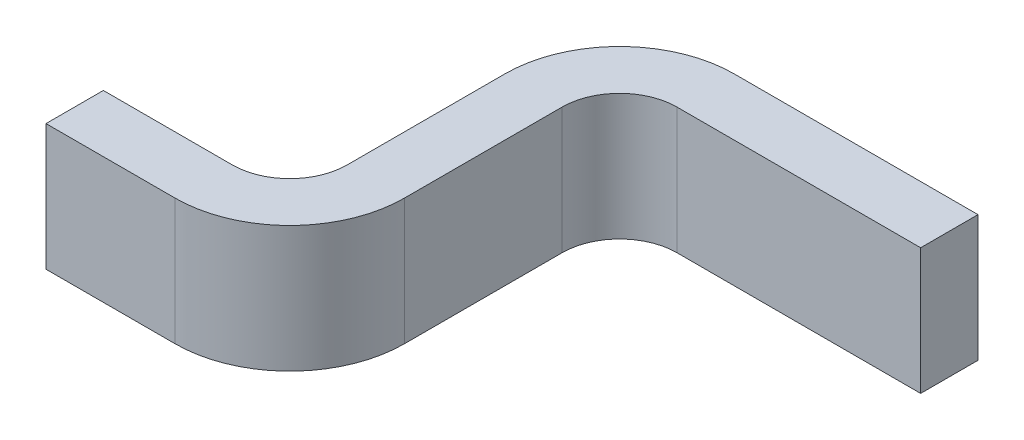
ISO-10303-21;
HEADER;
FILE_DESCRIPTION(('STEP AP214'),'2;1');
FILE_NAME('part.step','',(''),(''),'','','');
FILE_SCHEMA(('AUTOMOTIVE_DESIGN { 1 0 10303 214 1 1 1 1 }'));
ENDSEC;
DATA;
#1=APPLICATION_CONTEXT('core data for automotive mechanical design processes');
#2=APPLICATION_PROTOCOL_DEFINITION('international standard','automotive_design',2000,#1);
#3=PRODUCT_CONTEXT('',#1,'mechanical');
#4=PRODUCT('Part','Part','',(#3));
#5=PRODUCT_RELATED_PRODUCT_CATEGORY('part','',(#4));
#6=PRODUCT_DEFINITION_FORMATION('','',#4);
#7=PRODUCT_DEFINITION_CONTEXT('part definition',#1,'design');
#8=PRODUCT_DEFINITION('design','',#6,#7);
#9=PRODUCT_DEFINITION_SHAPE('','',#8);
#10=(LENGTH_UNIT() NAMED_UNIT(*) SI_UNIT(.MILLI.,.METRE.));
#11=(NAMED_UNIT(*) PLANE_ANGLE_UNIT() SI_UNIT($,.RADIAN.));
#12=(NAMED_UNIT(*) SI_UNIT($,.STERADIAN.) SOLID_ANGLE_UNIT());
#13=UNCERTAINTY_MEASURE_WITH_UNIT(LENGTH_MEASURE(1.E-05),#10,'distance_accuracy_value','');
#14=(GEOMETRIC_REPRESENTATION_CONTEXT(3) GLOBAL_UNCERTAINTY_ASSIGNED_CONTEXT((#13)) GLOBAL_UNIT_ASSIGNED_CONTEXT((#10,
#11,#12)) REPRESENTATION_CONTEXT('',''));
#15=CARTESIAN_POINT('',(0.,0.,0.));
#16=DIRECTION('',(0.,0.,1.));
#17=DIRECTION('',(1.,0.,0.));
#18=AXIS2_PLACEMENT_3D('',#15,#16,#17);
#19=CARTESIAN_POINT('',(0.,0.11,0.675));
#20=DIRECTION('',(0.,0.,-1.));
#21=DIRECTION('',(-1.,0.,0.));
#22=AXIS2_PLACEMENT_3D('',#19,#20,#21);
#23=PLANE('',#22);
#24=DIRECTION('',(1.,0.,0.));
#25=VECTOR('',#24,1.);
#26=CARTESIAN_POINT('',(0.,0.11,0.675));
#27=LINE('',#26,#25);
#28=CARTESIAN_POINT('',(0.225,0.11,0.675));
#29=VERTEX_POINT('',#28);
#30=CARTESIAN_POINT('',(0.,0.11,0.675));
#31=VERTEX_POINT('',#30);
#32=EDGE_CURVE('E104',#29,#31,#27,.F.);
#33=ORIENTED_EDGE('',*,*,#32,.T.);
#34=DIRECTION('',(0.,1.,0.));
#35=VECTOR('',#34,1.);
#36=CARTESIAN_POINT('',(0.,-0.11,0.675));
#37=LINE('',#36,#35);
#38=CARTESIAN_POINT('',(0.,-0.11,0.675));
#39=VERTEX_POINT('',#38);
#40=EDGE_CURVE('E113',#39,#31,#37,.T.);
#41=ORIENTED_EDGE('',*,*,#40,.F.);
#42=DIRECTION('',(1.,0.,0.));
#43=VECTOR('',#42,1.);
#44=CARTESIAN_POINT('',(0.,-0.11,0.675));
#45=LINE('',#44,#43);
#46=CARTESIAN_POINT('',(0.225,-0.11,0.675));
#47=VERTEX_POINT('',#46);
#48=EDGE_CURVE('E118',#39,#47,#45,.T.);
#49=ORIENTED_EDGE('',*,*,#48,.T.);
#50=DIRECTION('',(0.,1.,0.));
#51=VECTOR('',#50,1.);
#52=CARTESIAN_POINT('',(0.225,0.11,0.675));
#53=LINE('',#52,#51);
#54=EDGE_CURVE('E116',#29,#47,#53,.F.);
#55=ORIENTED_EDGE('',*,*,#54,.F.);
#56=EDGE_LOOP('',(#33,#41,#49,#55));
#57=FACE_BOUND('',#56,.T.);
#58=ADVANCED_FACE('F17',(#57),#23,.F.);
#59=CARTESIAN_POINT('',(0.,-0.11,0.575));
#60=DIRECTION('',(-1.,0.,0.));
#61=DIRECTION('',(0.,0.,1.));
#62=AXIS2_PLACEMENT_3D('',#59,#60,#61);
#63=PLANE('',#62);
#64=DIRECTION('',(0.,0.,1.));
#65=VECTOR('',#64,1.);
#66=CARTESIAN_POINT('',(0.,0.11,0.575));
#67=LINE('',#66,#65);
#68=CARTESIAN_POINT('',(0.,0.11,0.575));
#69=VERTEX_POINT('',#68);
#70=EDGE_CURVE('E111',#31,#69,#67,.F.);
#71=ORIENTED_EDGE('',*,*,#70,.T.);
#72=DIRECTION('',(0.,1.,0.));
#73=VECTOR('',#72,1.);
#74=CARTESIAN_POINT('',(0.,-0.11,0.575));
#75=LINE('',#74,#73);
#76=CARTESIAN_POINT('',(0.,-0.11,0.575));
#77=VERTEX_POINT('',#76);
#78=EDGE_CURVE('E127',#69,#77,#75,.F.);
#79=ORIENTED_EDGE('',*,*,#78,.T.);
#80=DIRECTION('',(0.,0.,1.));
#81=VECTOR('',#80,1.);
#82=CARTESIAN_POINT('',(0.,-0.11,0.675));
#83=LINE('',#82,#81);
#84=EDGE_CURVE('E140',#77,#39,#83,.T.);
#85=ORIENTED_EDGE('',*,*,#84,.T.);
#86=ORIENTED_EDGE('',*,*,#40,.T.);
#87=EDGE_LOOP('',(#71,#79,#85,#86));
#88=FACE_BOUND('',#87,.T.);
#89=ADVANCED_FACE('F277',(#88),#63,.T.);
#90=CARTESIAN_POINT('',(0.225,0.11,0.475));
#91=DIRECTION('',(0.,1.,0.));
#92=DIRECTION('',(0.,0.,1.));
#93=AXIS2_PLACEMENT_3D('',#90,#91,#92);
#94=CYLINDRICAL_SURFACE('',#93,0.2);
#95=CARTESIAN_POINT('',(0.225,0.11,0.475));
#96=DIRECTION('',(0.,1.,0.));
#97=DIRECTION('',(0.,0.,1.));
#98=AXIS2_PLACEMENT_3D('',#95,#96,#97);
#99=CIRCLE('',#98,0.2);
#100=CARTESIAN_POINT('',(0.425,0.11,0.475));
#101=VERTEX_POINT('',#100);
#102=EDGE_CURVE('E20',#29,#101,#99,.T.);
#103=ORIENTED_EDGE('',*,*,#102,.F.);
#104=ORIENTED_EDGE('',*,*,#54,.T.);
#105=CARTESIAN_POINT('',(0.225,-0.11,0.475));
#106=DIRECTION('',(0.,1.,0.));
#107=DIRECTION('',(0.,0.,1.));
#108=AXIS2_PLACEMENT_3D('',#105,#106,#107);
#109=CIRCLE('',#108,0.2);
#110=CARTESIAN_POINT('',(0.425,-0.11,0.475));
#111=VERTEX_POINT('',#110);
#112=EDGE_CURVE('E178',#111,#47,#109,.F.);
#113=ORIENTED_EDGE('',*,*,#112,.F.);
#114=DIRECTION('',(0.,1.,0.));
#115=VECTOR('',#114,1.);
#116=CARTESIAN_POINT('',(0.425,0.11,0.475));
#117=LINE('',#116,#115);
#118=EDGE_CURVE('E124',#111,#101,#117,.T.);
#119=ORIENTED_EDGE('',*,*,#118,.T.);
#120=EDGE_LOOP('',(#103,#104,#113,#119));
#121=FACE_BOUND('',#120,.T.);
#122=ADVANCED_FACE('F123',(#121),#94,.T.);
#123=CARTESIAN_POINT('',(0.,-0.11,0.575));
#124=DIRECTION('',(0.,0.,1.));
#125=DIRECTION('',(1.,0.,0.));
#126=AXIS2_PLACEMENT_3D('',#123,#124,#125);
#127=PLANE('',#126);
#128=DIRECTION('',(1.,0.,0.));
#129=VECTOR('',#128,1.);
#130=CARTESIAN_POINT('',(0.,-0.11,0.575));
#131=LINE('',#130,#129);
#132=CARTESIAN_POINT('',(0.225,-0.11,0.575));
#133=VERTEX_POINT('',#132);
#134=EDGE_CURVE('E131',#77,#133,#131,.T.);
#135=ORIENTED_EDGE('',*,*,#134,.F.);
#136=ORIENTED_EDGE('',*,*,#78,.F.);
#137=DIRECTION('',(1.,0.,0.));
#138=VECTOR('',#137,1.);
#139=CARTESIAN_POINT('',(0.,0.11,0.575));
#140=LINE('',#139,#138);
#141=CARTESIAN_POINT('',(0.225,0.11,0.575));
#142=VERTEX_POINT('',#141);
#143=EDGE_CURVE('E126',#142,#69,#140,.F.);
#144=ORIENTED_EDGE('',*,*,#143,.F.);
#145=DIRECTION('',(0.,1.,0.));
#146=VECTOR('',#145,1.);
#147=CARTESIAN_POINT('',(0.225,-0.11,0.575));
#148=LINE('',#147,#146);
#149=EDGE_CURVE('E175',#142,#133,#148,.F.);
#150=ORIENTED_EDGE('',*,*,#149,.T.);
#151=EDGE_LOOP('',(#135,#136,#144,#150));
#152=FACE_BOUND('',#151,.T.);
#153=ADVANCED_FACE('F271',(#152),#127,.F.);
#154=CARTESIAN_POINT('',(0.425,0.11,0.475));
#155=DIRECTION('',(-1.,0.,0.));
#156=DIRECTION('',(0.,0.,1.));
#157=AXIS2_PLACEMENT_3D('',#154,#155,#156);
#158=PLANE('',#157);
#159=DIRECTION('',(0.,0.,-1.));
#160=VECTOR('',#159,1.);
#161=CARTESIAN_POINT('',(0.425,0.11,0.475));
#162=LINE('',#161,#160);
#163=CARTESIAN_POINT('',(0.425,0.11,0.2));
#164=VERTEX_POINT('',#163);
#165=EDGE_CURVE('E177',#164,#101,#162,.F.);
#166=ORIENTED_EDGE('',*,*,#165,.T.);
#167=ORIENTED_EDGE('',*,*,#118,.F.);
#168=DIRECTION('',(0.,0.,1.));
#169=VECTOR('',#168,1.);
#170=CARTESIAN_POINT('',(0.425,-0.11,0.475));
#171=LINE('',#170,#169);
#172=CARTESIAN_POINT('',(0.425,-0.11,0.2));
#173=VERTEX_POINT('',#172);
#174=EDGE_CURVE('E174',#111,#173,#171,.F.);
#175=ORIENTED_EDGE('',*,*,#174,.T.);
#176=DIRECTION('',(0.,-1.,0.));
#177=VECTOR('',#176,1.);
#178=CARTESIAN_POINT('',(0.425,0.11,0.2));
#179=LINE('',#178,#177);
#180=EDGE_CURVE('E171',#173,#164,#179,.F.);
#181=ORIENTED_EDGE('',*,*,#180,.T.);
#182=EDGE_LOOP('',(#166,#167,#175,#181));
#183=FACE_BOUND('',#182,.T.);
#184=ADVANCED_FACE('F267',(#183),#158,.F.);
#185=CARTESIAN_POINT('',(0.225,-0.11,0.475));
#186=DIRECTION('',(0.,1.,0.));
#187=DIRECTION('',(0.,0.,1.));
#188=AXIS2_PLACEMENT_3D('',#185,#186,#187);
#189=CYLINDRICAL_SURFACE('',#188,0.1);
#190=CARTESIAN_POINT('',(0.225,-0.11,0.475));
#191=DIRECTION('',(0.,1.,0.));
#192=DIRECTION('',(0.,0.,1.));
#193=AXIS2_PLACEMENT_3D('',#190,#191,#192);
#194=CIRCLE('',#193,0.1);
#195=CARTESIAN_POINT('',(0.325,-0.11,0.475));
#196=VERTEX_POINT('',#195);
#197=EDGE_CURVE('E172',#133,#196,#194,.T.);
#198=ORIENTED_EDGE('',*,*,#197,.F.);
#199=ORIENTED_EDGE('',*,*,#149,.F.);
#200=CARTESIAN_POINT('',(0.225,0.11,0.475));
#201=DIRECTION('',(0.,1.,0.));
#202=DIRECTION('',(0.,0.,1.));
#203=AXIS2_PLACEMENT_3D('',#200,#201,#202);
#204=CIRCLE('',#203,0.1);
#205=CARTESIAN_POINT('',(0.325,0.11,0.475));
#206=VERTEX_POINT('',#205);
#207=EDGE_CURVE('E176',#206,#142,#204,.F.);
#208=ORIENTED_EDGE('',*,*,#207,.F.);
#209=DIRECTION('',(0.,1.,0.));
#210=VECTOR('',#209,1.);
#211=CARTESIAN_POINT('',(0.325,-0.11,0.475));
#212=LINE('',#211,#210);
#213=EDGE_CURVE('E188',#206,#196,#212,.F.);
#214=ORIENTED_EDGE('',*,*,#213,.T.);
#215=EDGE_LOOP('',(#198,#199,#208,#214));
#216=FACE_BOUND('',#215,.T.);
#217=ADVANCED_FACE('F263',(#216),#189,.F.);
#218=CARTESIAN_POINT('',(0.525,0.11,0.2));
#219=DIRECTION('',(0.,-1.,0.));
#220=DIRECTION('',(0.,0.,-1.));
#221=AXIS2_PLACEMENT_3D('',#218,#219,#220);
#222=CYLINDRICAL_SURFACE('',#221,0.1);
#223=CARTESIAN_POINT('',(0.525,0.11,0.2));
#224=DIRECTION('',(0.,-1.,0.));
#225=DIRECTION('',(0.,0.,-1.));
#226=AXIS2_PLACEMENT_3D('',#223,#224,#225);
#227=CIRCLE('',#226,0.1);
#228=CARTESIAN_POINT('',(0.525,0.11,0.1));
#229=VERTEX_POINT('',#228);
#230=EDGE_CURVE('E168',#164,#229,#227,.T.);
#231=ORIENTED_EDGE('',*,*,#230,.F.);
#232=ORIENTED_EDGE('',*,*,#180,.F.);
#233=CARTESIAN_POINT('',(0.525,-0.11,0.2));
#234=DIRECTION('',(0.,-1.,0.));
#235=DIRECTION('',(0.,0.,-1.));
#236=AXIS2_PLACEMENT_3D('',#233,#234,#235);
#237=CIRCLE('',#236,0.1);
#238=CARTESIAN_POINT('',(0.525,-0.11,0.1));
#239=VERTEX_POINT('',#238);
#240=EDGE_CURVE('E163',#239,#173,#237,.F.);
#241=ORIENTED_EDGE('',*,*,#240,.F.);
#242=DIRECTION('',(0.,1.,0.));
#243=VECTOR('',#242,1.);
#244=CARTESIAN_POINT('',(0.525,0.11,0.1));
#245=LINE('',#244,#243);
#246=EDGE_CURVE('E166',#239,#229,#245,.T.);
#247=ORIENTED_EDGE('',*,*,#246,.T.);
#248=EDGE_LOOP('',(#231,#232,#241,#247));
#249=FACE_BOUND('',#248,.T.);
#250=ADVANCED_FACE('F259',(#249),#222,.F.);
#251=CARTESIAN_POINT('',(0.325,-0.11,0.475));
#252=DIRECTION('',(1.,0.,0.));
#253=DIRECTION('',(0.,0.,-1.));
#254=AXIS2_PLACEMENT_3D('',#251,#252,#253);
#255=PLANE('',#254);
#256=DIRECTION('',(0.,0.,-1.));
#257=VECTOR('',#256,1.);
#258=CARTESIAN_POINT('',(0.325,-0.11,0.475));
#259=LINE('',#258,#257);
#260=CARTESIAN_POINT('',(0.325,-0.11,0.2));
#261=VERTEX_POINT('',#260);
#262=EDGE_CURVE('E167',#196,#261,#259,.T.);
#263=ORIENTED_EDGE('',*,*,#262,.F.);
#264=ORIENTED_EDGE('',*,*,#213,.F.);
#265=DIRECTION('',(0.,0.,-1.));
#266=VECTOR('',#265,1.);
#267=CARTESIAN_POINT('',(0.325,0.11,0.475));
#268=LINE('',#267,#266);
#269=CARTESIAN_POINT('',(0.325,0.11,0.2));
#270=VERTEX_POINT('',#269);
#271=EDGE_CURVE('E170',#270,#206,#268,.F.);
#272=ORIENTED_EDGE('',*,*,#271,.F.);
#273=DIRECTION('',(0.,-1.,0.));
#274=VECTOR('',#273,1.);
#275=CARTESIAN_POINT('',(0.325,-0.11,0.2));
#276=LINE('',#275,#274);
#277=EDGE_CURVE('E159',#261,#270,#276,.F.);
#278=ORIENTED_EDGE('',*,*,#277,.F.);
#279=EDGE_LOOP('',(#263,#264,#272,#278));
#280=FACE_BOUND('',#279,.T.);
#281=ADVANCED_FACE('F255',(#280),#255,.F.);
#282=CARTESIAN_POINT('',(0.525,0.11,0.1));
#283=DIRECTION('',(0.,0.,-1.));
#284=DIRECTION('',(-1.,0.,0.));
#285=AXIS2_PLACEMENT_3D('',#282,#283,#284);
#286=PLANE('',#285);
#287=DIRECTION('',(1.,0.,0.));
#288=VECTOR('',#287,1.);
#289=CARTESIAN_POINT('',(0.525,0.11,0.1));
#290=LINE('',#289,#288);
#291=CARTESIAN_POINT('',(0.95,0.11,0.1));
#292=VERTEX_POINT('',#291);
#293=EDGE_CURVE('E162',#292,#229,#290,.F.);
#294=ORIENTED_EDGE('',*,*,#293,.T.);
#295=ORIENTED_EDGE('',*,*,#246,.F.);
#296=DIRECTION('',(1.,0.,0.));
#297=VECTOR('',#296,1.);
#298=CARTESIAN_POINT('',(0.525,-0.11,0.1));
#299=LINE('',#298,#297);
#300=CARTESIAN_POINT('',(0.95,-0.11,0.1));
#301=VERTEX_POINT('',#300);
#302=EDGE_CURVE('E216',#239,#301,#299,.T.);
#303=ORIENTED_EDGE('',*,*,#302,.T.);
#304=DIRECTION('',(0.,1.,0.));
#305=VECTOR('',#304,1.);
#306=CARTESIAN_POINT('',(0.95,-0.11,0.1));
#307=LINE('',#306,#305);
#308=EDGE_CURVE('E197',#301,#292,#307,.T.);
#309=ORIENTED_EDGE('',*,*,#308,.T.);
#310=EDGE_LOOP('',(#294,#295,#303,#309));
#311=FACE_BOUND('',#310,.T.);
#312=ADVANCED_FACE('F252',(#311),#286,.F.);
#313=CARTESIAN_POINT('',(0.525,0.11,0.));
#314=DIRECTION('',(0.,-1.,0.));
#315=DIRECTION('',(0.,0.,-1.));
#316=AXIS2_PLACEMENT_3D('',#313,#314,#315);
#317=PLANE('',#316);
#318=DIRECTION('',(1.,0.,0.));
#319=VECTOR('',#318,1.);
#320=CARTESIAN_POINT('',(0.525,0.11,0.));
#321=LINE('',#320,#319);
#322=CARTESIAN_POINT('',(0.95,0.11,0.));
#323=VERTEX_POINT('',#322);
#324=CARTESIAN_POINT('',(0.525,0.11,0.));
#325=VERTEX_POINT('',#324);
#326=EDGE_CURVE('E205',#323,#325,#321,.F.);
#327=ORIENTED_EDGE('',*,*,#326,.T.);
#328=CARTESIAN_POINT('',(0.525,0.11,0.2));
#329=DIRECTION('',(0.,-1.,0.));
#330=DIRECTION('',(0.,0.,-1.));
#331=AXIS2_PLACEMENT_3D('',#328,#329,#330);
#332=CIRCLE('',#331,0.2);
#333=EDGE_CURVE('E160',#270,#325,#332,.T.);
#334=ORIENTED_EDGE('',*,*,#333,.F.);
#335=ORIENTED_EDGE('',*,*,#271,.T.);
#336=ORIENTED_EDGE('',*,*,#207,.T.);
#337=ORIENTED_EDGE('',*,*,#143,.T.);
#338=ORIENTED_EDGE('',*,*,#70,.F.);
#339=ORIENTED_EDGE('',*,*,#32,.F.);
#340=ORIENTED_EDGE('',*,*,#102,.T.);
#341=ORIENTED_EDGE('',*,*,#165,.F.);
#342=ORIENTED_EDGE('',*,*,#230,.T.);
#343=ORIENTED_EDGE('',*,*,#293,.F.);
#344=DIRECTION('',(0.,0.,1.));
#345=VECTOR('',#344,1.);
#346=CARTESIAN_POINT('',(0.95,0.11,0.));
#347=LINE('',#346,#345);
#348=EDGE_CURVE('E200',#292,#323,#347,.F.);
#349=ORIENTED_EDGE('',*,*,#348,.T.);
#350=EDGE_LOOP('',(#327,#334,#335,#336,#337,#338,#339,#340,#341,#342,#343,#349));
#351=FACE_BOUND('',#350,.T.);
#352=ADVANCED_FACE('F107',(#351),#317,.F.);
#353=CARTESIAN_POINT('',(0.525,-0.11,0.2));
#354=DIRECTION('',(0.,-1.,0.));
#355=DIRECTION('',(0.,0.,-1.));
#356=AXIS2_PLACEMENT_3D('',#353,#354,#355);
#357=CYLINDRICAL_SURFACE('',#356,0.2);
#358=CARTESIAN_POINT('',(0.525,-0.11,0.2));
#359=DIRECTION('',(0.,-1.,0.));
#360=DIRECTION('',(0.,0.,-1.));
#361=AXIS2_PLACEMENT_3D('',#358,#359,#360);
#362=CIRCLE('',#361,0.2);
#363=CARTESIAN_POINT('',(0.525,-0.11,0.));
#364=VERTEX_POINT('',#363);
#365=EDGE_CURVE('E157',#364,#261,#362,.F.);
#366=ORIENTED_EDGE('',*,*,#365,.T.);
#367=ORIENTED_EDGE('',*,*,#277,.T.);
#368=ORIENTED_EDGE('',*,*,#333,.T.);
#369=DIRECTION('',(0.,1.,0.));
#370=VECTOR('',#369,1.);
#371=CARTESIAN_POINT('',(0.525,-0.11,0.));
#372=LINE('',#371,#370);
#373=EDGE_CURVE('E211',#325,#364,#372,.F.);
#374=ORIENTED_EDGE('',*,*,#373,.T.);
#375=EDGE_LOOP('',(#366,#367,#368,#374));
#376=FACE_BOUND('',#375,.T.);
#377=ADVANCED_FACE('F233',(#376),#357,.T.);
#378=CARTESIAN_POINT('',(0.525,-0.11,0.1));
#379=DIRECTION('',(0.,1.,0.));
#380=DIRECTION('',(0.,0.,1.));
#381=AXIS2_PLACEMENT_3D('',#378,#379,#380);
#382=PLANE('',#381);
#383=ORIENTED_EDGE('',*,*,#302,.F.);
#384=ORIENTED_EDGE('',*,*,#240,.T.);
#385=ORIENTED_EDGE('',*,*,#174,.F.);
#386=ORIENTED_EDGE('',*,*,#112,.T.);
#387=ORIENTED_EDGE('',*,*,#48,.F.);
#388=ORIENTED_EDGE('',*,*,#84,.F.);
#389=ORIENTED_EDGE('',*,*,#134,.T.);
#390=ORIENTED_EDGE('',*,*,#197,.T.);
#391=ORIENTED_EDGE('',*,*,#262,.T.);
#392=ORIENTED_EDGE('',*,*,#365,.F.);
#393=DIRECTION('',(1.,0.,0.));
#394=VECTOR('',#393,1.);
#395=CARTESIAN_POINT('',(0.525,-0.11,0.));
#396=LINE('',#395,#394);
#397=CARTESIAN_POINT('',(0.95,-0.11,0.));
#398=VERTEX_POINT('',#397);
#399=EDGE_CURVE('E26',#364,#398,#396,.T.);
#400=ORIENTED_EDGE('',*,*,#399,.T.);
#401=DIRECTION('',(0.,0.,1.));
#402=VECTOR('',#401,1.);
#403=CARTESIAN_POINT('',(0.95,-0.11,0.));
#404=LINE('',#403,#402);
#405=EDGE_CURVE('E34',#398,#301,#404,.T.);
#406=ORIENTED_EDGE('',*,*,#405,.T.);
#407=EDGE_LOOP('',(#383,#384,#385,#386,#387,#388,#389,#390,#391,#392,#400,#406));
#408=FACE_BOUND('',#407,.T.);
#409=ADVANCED_FACE('F227',(#408),#382,.F.);
#410=CARTESIAN_POINT('',(0.95,-0.11,0.));
#411=DIRECTION('',(-1.,0.,0.));
#412=DIRECTION('',(0.,0.,1.));
#413=AXIS2_PLACEMENT_3D('',#410,#411,#412);
#414=PLANE('',#413);
#415=ORIENTED_EDGE('',*,*,#348,.F.);
#416=ORIENTED_EDGE('',*,*,#308,.F.);
#417=ORIENTED_EDGE('',*,*,#405,.F.);
#418=DIRECTION('',(0.,1.,0.));
#419=VECTOR('',#418,1.);
#420=CARTESIAN_POINT('',(0.95,-0.11,0.));
#421=LINE('',#420,#419);
#422=EDGE_CURVE('E11',#398,#323,#421,.T.);
#423=ORIENTED_EDGE('',*,*,#422,.T.);
#424=EDGE_LOOP('',(#415,#416,#417,#423));
#425=FACE_BOUND('',#424,.T.);
#426=ADVANCED_FACE('F237',(#425),#414,.F.);
#427=CARTESIAN_POINT('',(0.525,-0.11,0.));
#428=DIRECTION('',(0.,0.,1.));
#429=DIRECTION('',(1.,0.,0.));
#430=AXIS2_PLACEMENT_3D('',#427,#428,#429);
#431=PLANE('',#430);
#432=ORIENTED_EDGE('',*,*,#399,.F.);
#433=ORIENTED_EDGE('',*,*,#373,.F.);
#434=ORIENTED_EDGE('',*,*,#326,.F.);
#435=ORIENTED_EDGE('',*,*,#422,.F.);
#436=EDGE_LOOP('',(#432,#433,#434,#435));
#437=FACE_BOUND('',#436,.T.);
#438=ADVANCED_FACE('F231',(#437),#431,.F.);
#439=CLOSED_SHELL('',(#58,#89,#122,#153,#184,#217,#250,#281,#312,#352,#377,#409,#426,#438));
#440=MANIFOLD_SOLID_BREP('B1',#439);
#441=ADVANCED_BREP_SHAPE_REPRESENTATION('',(#18,#440),#14);
#442=SHAPE_DEFINITION_REPRESENTATION(#9,#441);
ENDSEC;
END-ISO-10303-21;
